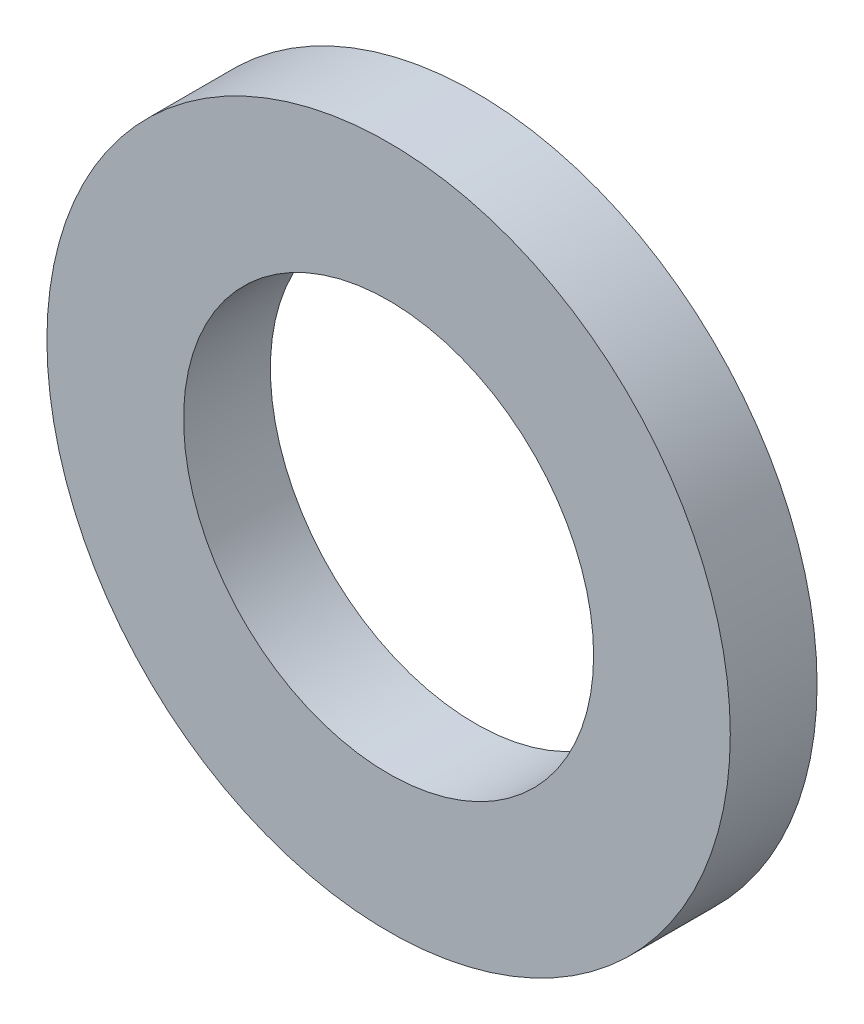
ISO-10303-21;
HEADER;
FILE_DESCRIPTION(('STEP AP214'),'2;1');
FILE_NAME('part.step','',(''),(''),'','','');
FILE_SCHEMA(('AUTOMOTIVE_DESIGN { 1 0 10303 214 1 1 1 1 }'));
ENDSEC;
DATA;
#1=APPLICATION_CONTEXT('core data for automotive mechanical design processes');
#2=APPLICATION_PROTOCOL_DEFINITION('international standard','automotive_design',2000,#1);
#3=PRODUCT_CONTEXT('',#1,'mechanical');
#4=PRODUCT('Part','Part','',(#3));
#5=PRODUCT_RELATED_PRODUCT_CATEGORY('part','',(#4));
#6=PRODUCT_DEFINITION_FORMATION('','',#4);
#7=PRODUCT_DEFINITION_CONTEXT('part definition',#1,'design');
#8=PRODUCT_DEFINITION('design','',#6,#7);
#9=PRODUCT_DEFINITION_SHAPE('','',#8);
#10=(LENGTH_UNIT() NAMED_UNIT(*) SI_UNIT(.MILLI.,.METRE.));
#11=(NAMED_UNIT(*) PLANE_ANGLE_UNIT() SI_UNIT($,.RADIAN.));
#12=(NAMED_UNIT(*) SI_UNIT($,.STERADIAN.) SOLID_ANGLE_UNIT());
#13=UNCERTAINTY_MEASURE_WITH_UNIT(LENGTH_MEASURE(1.E-05),#10,'distance_accuracy_value','');
#14=(GEOMETRIC_REPRESENTATION_CONTEXT(3) GLOBAL_UNCERTAINTY_ASSIGNED_CONTEXT((#13)) GLOBAL_UNIT_ASSIGNED_CONTEXT((#10,
#11,#12)) REPRESENTATION_CONTEXT('',''));
#15=CARTESIAN_POINT('',(0.,0.,0.));
#16=DIRECTION('',(0.,0.,1.));
#17=DIRECTION('',(1.,0.,0.));
#18=AXIS2_PLACEMENT_3D('',#15,#16,#17);
#19=CARTESIAN_POINT('',(0.,0.,3.175));
#20=DIRECTION('',(0.,0.,1.));
#21=DIRECTION('',(1.,0.,0.));
#22=AXIS2_PLACEMENT_3D('',#19,#20,#21);
#23=PLANE('',#22);
#24=CARTESIAN_POINT('',(0.,0.,3.175));
#25=DIRECTION('',(0.,0.,1.));
#26=DIRECTION('',(1.,0.,0.));
#27=AXIS2_PLACEMENT_3D('',#24,#25,#26);
#28=CIRCLE('',#27,12.5);
#29=CARTESIAN_POINT('',(12.5,0.,3.175));
#30=VERTEX_POINT('',#29);
#31=EDGE_CURVE('E10',#30,#30,#28,.T.);
#32=ORIENTED_EDGE('',*,*,#31,.T.);
#33=EDGE_LOOP('',(#32));
#34=FACE_BOUND('',#33,.T.);
#35=CARTESIAN_POINT('',(0.,0.,3.175));
#36=DIRECTION('',(0.,0.,1.));
#37=DIRECTION('',(1.,0.,0.));
#38=AXIS2_PLACEMENT_3D('',#35,#36,#37);
#39=CIRCLE('',#38,7.5);
#40=CARTESIAN_POINT('',(7.5,0.,3.175));
#41=VERTEX_POINT('',#40);
#42=EDGE_CURVE('E43',#41,#41,#39,.T.);
#43=ORIENTED_EDGE('',*,*,#42,.F.);
#44=EDGE_LOOP('',(#43));
#45=FACE_BOUND('',#44,.T.);
#46=ADVANCED_FACE('F32',(#34,#45),#23,.T.);
#47=CARTESIAN_POINT('',(0.,0.,0.));
#48=DIRECTION('',(0.,0.,1.));
#49=DIRECTION('',(1.,0.,0.));
#50=AXIS2_PLACEMENT_3D('',#47,#48,#49);
#51=PLANE('',#50);
#52=CARTESIAN_POINT('',(0.,0.,0.));
#53=DIRECTION('',(0.,0.,1.));
#54=DIRECTION('',(1.,0.,0.));
#55=AXIS2_PLACEMENT_3D('',#52,#53,#54);
#56=CIRCLE('',#55,12.5);
#57=CARTESIAN_POINT('',(12.5,0.,0.));
#58=VERTEX_POINT('',#57);
#59=EDGE_CURVE('E36',#58,#58,#56,.T.);
#60=ORIENTED_EDGE('',*,*,#59,.F.);
#61=EDGE_LOOP('',(#60));
#62=FACE_BOUND('',#61,.T.);
#63=CARTESIAN_POINT('',(0.,0.,0.));
#64=DIRECTION('',(0.,0.,1.));
#65=DIRECTION('',(1.,0.,0.));
#66=AXIS2_PLACEMENT_3D('',#63,#64,#65);
#67=CIRCLE('',#66,7.5);
#68=CARTESIAN_POINT('',(7.5,0.,0.));
#69=VERTEX_POINT('',#68);
#70=EDGE_CURVE('E45',#69,#69,#67,.T.);
#71=ORIENTED_EDGE('',*,*,#70,.T.);
#72=EDGE_LOOP('',(#71));
#73=FACE_BOUND('',#72,.T.);
#74=ADVANCED_FACE('F55',(#62,#73),#51,.F.);
#75=CARTESIAN_POINT('',(0.,0.,3.175));
#76=DIRECTION('',(0.,0.,-1.));
#77=DIRECTION('',(-1.,0.,0.));
#78=AXIS2_PLACEMENT_3D('',#75,#76,#77);
#79=CYLINDRICAL_SURFACE('',#78,12.5);
#80=ORIENTED_EDGE('',*,*,#31,.F.);
#81=EDGE_LOOP('',(#80));
#82=FACE_BOUND('',#81,.T.);
#83=ORIENTED_EDGE('',*,*,#59,.T.);
#84=EDGE_LOOP('',(#83));
#85=FACE_BOUND('',#84,.T.);
#86=ADVANCED_FACE('F34',(#82,#85),#79,.T.);
#87=CARTESIAN_POINT('',(0.,0.,3.175));
#88=DIRECTION('',(0.,0.,-1.));
#89=DIRECTION('',(-1.,0.,0.));
#90=AXIS2_PLACEMENT_3D('',#87,#88,#89);
#91=CYLINDRICAL_SURFACE('',#90,7.5);
#92=ORIENTED_EDGE('',*,*,#42,.T.);
#93=EDGE_LOOP('',(#92));
#94=FACE_BOUND('',#93,.T.);
#95=ORIENTED_EDGE('',*,*,#70,.F.);
#96=EDGE_LOOP('',(#95));
#97=FACE_BOUND('',#96,.T.);
#98=ADVANCED_FACE('F51',(#94,#97),#91,.F.);
#99=CLOSED_SHELL('',(#46,#74,#86,#98));
#100=MANIFOLD_SOLID_BREP('B2',#99);
#101=ADVANCED_BREP_SHAPE_REPRESENTATION('',(#18,#100),#14);
#102=SHAPE_DEFINITION_REPRESENTATION(#9,#101);
ENDSEC;
END-ISO-10303-21;
